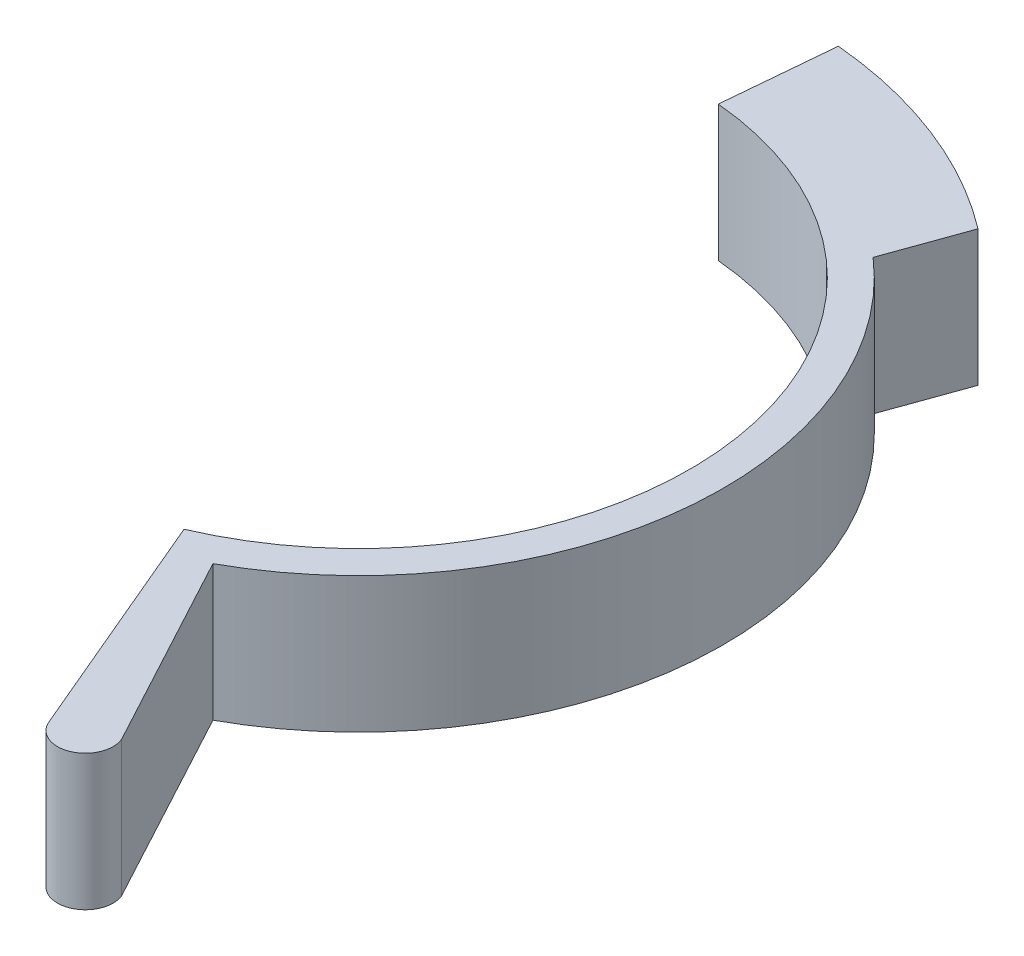
ISO-10303-21;
HEADER;
FILE_DESCRIPTION(('STEP AP214'),'2;1');
FILE_NAME('part.step','',(''),(''),'','','');
FILE_SCHEMA(('AUTOMOTIVE_DESIGN { 1 0 10303 214 1 1 1 1 }'));
ENDSEC;
DATA;
#1=APPLICATION_CONTEXT('core data for automotive mechanical design processes');
#2=APPLICATION_PROTOCOL_DEFINITION('international standard','automotive_design',2000,#1);
#3=PRODUCT_CONTEXT('',#1,'mechanical');
#4=PRODUCT('Part','Part','',(#3));
#5=PRODUCT_RELATED_PRODUCT_CATEGORY('part','',(#4));
#6=PRODUCT_DEFINITION_FORMATION('','',#4);
#7=PRODUCT_DEFINITION_CONTEXT('part definition',#1,'design');
#8=PRODUCT_DEFINITION('design','',#6,#7);
#9=PRODUCT_DEFINITION_SHAPE('','',#8);
#10=(LENGTH_UNIT() NAMED_UNIT(*) SI_UNIT(.MILLI.,.METRE.));
#11=(NAMED_UNIT(*) PLANE_ANGLE_UNIT() SI_UNIT($,.RADIAN.));
#12=(NAMED_UNIT(*) SI_UNIT($,.STERADIAN.) SOLID_ANGLE_UNIT());
#13=UNCERTAINTY_MEASURE_WITH_UNIT(LENGTH_MEASURE(1.E-05),#10,'distance_accuracy_value','');
#14=(GEOMETRIC_REPRESENTATION_CONTEXT(3) GLOBAL_UNCERTAINTY_ASSIGNED_CONTEXT((#13)) GLOBAL_UNIT_ASSIGNED_CONTEXT((#10,
#11,#12)) REPRESENTATION_CONTEXT('',''));
#15=CARTESIAN_POINT('',(0.,0.,0.));
#16=DIRECTION('',(0.,0.,1.));
#17=DIRECTION('',(1.,0.,0.));
#18=AXIS2_PLACEMENT_3D('',#15,#16,#17);
#19=CARTESIAN_POINT('',(0.,12.26,0.));
#20=DIRECTION('',(0.,-1.,0.));
#21=DIRECTION('',(0.,0.,-1.));
#22=AXIS2_PLACEMENT_3D('',#19,#20,#21);
#23=CYLINDRICAL_SURFACE('',#22,33.);
#24=CARTESIAN_POINT('',(0.,0.,0.));
#25=DIRECTION('',(0.,1.,0.));
#26=DIRECTION('',(0.,0.,1.));
#27=AXIS2_PLACEMENT_3D('',#24,#25,#26);
#28=CIRCLE('',#27,33.);
#29=CARTESIAN_POINT('',(15.8232931656359,0.,28.9589950342608));
#30=VERTEX_POINT('',#29);
#31=CARTESIAN_POINT('',(21.6864186998569,0.,-24.8736656722426));
#32=VERTEX_POINT('',#31);
#33=EDGE_CURVE('E130',#30,#32,#28,.T.);
#34=ORIENTED_EDGE('',*,*,#33,.T.);
#35=DIRECTION('',(0.,-1.,0.));
#36=VECTOR('',#35,1.);
#37=CARTESIAN_POINT('',(21.6864186998569,12.26,-24.8736656722426));
#38=LINE('',#37,#36);
#39=CARTESIAN_POINT('',(21.6864186998569,12.26,-24.8736656722426));
#40=VERTEX_POINT('',#39);
#41=EDGE_CURVE('E11',#40,#32,#38,.T.);
#42=ORIENTED_EDGE('',*,*,#41,.F.);
#43=CARTESIAN_POINT('',(0.,12.26,0.));
#44=DIRECTION('',(0.,1.,0.));
#45=DIRECTION('',(0.,0.,1.));
#46=AXIS2_PLACEMENT_3D('',#43,#44,#45);
#47=CIRCLE('',#46,33.);
#48=CARTESIAN_POINT('',(15.8232931656359,12.26,28.9589950342608));
#49=VERTEX_POINT('',#48);
#50=EDGE_CURVE('E146',#49,#40,#47,.T.);
#51=ORIENTED_EDGE('',*,*,#50,.F.);
#52=DIRECTION('',(0.,-1.,0.));
#53=VECTOR('',#52,1.);
#54=CARTESIAN_POINT('',(15.8232931656359,12.26,28.9589950342608));
#55=LINE('',#54,#53);
#56=EDGE_CURVE('E126',#49,#30,#55,.T.);
#57=ORIENTED_EDGE('',*,*,#56,.T.);
#58=EDGE_LOOP('',(#34,#42,#51,#57));
#59=FACE_BOUND('',#58,.T.);
#60=ADVANCED_FACE('F35',(#59),#23,.T.);
#61=CARTESIAN_POINT('',(11.2933852003912,12.26,4.05702486011401));
#62=DIRECTION('',(-0.94111543336594,0.,-0.338085405009502));
#63=DIRECTION('',(-0.338085405009502,0.,0.94111543336594));
#64=AXIS2_PLACEMENT_3D('',#61,#62,#63);
#65=PLANE('',#64);
#66=DIRECTION('',(0.338085405009502,0.,-0.94111543336594));
#67=VECTOR('',#66,1.);
#68=CARTESIAN_POINT('',(11.2933852003912,0.,4.05702486011401));
#69=LINE('',#68,#67);
#70=CARTESIAN_POINT('',(24.1939050154192,0.,-31.8536595896471));
#71=VERTEX_POINT('',#70);
#72=EDGE_CURVE('E133',#32,#71,#69,.T.);
#73=ORIENTED_EDGE('',*,*,#72,.T.);
#74=DIRECTION('',(0.,-1.,0.));
#75=VECTOR('',#74,1.);
#76=CARTESIAN_POINT('',(24.1939050154192,12.26,-31.8536595896471));
#77=LINE('',#76,#75);
#78=CARTESIAN_POINT('',(24.1939050154192,12.26,-31.8536595896471));
#79=VERTEX_POINT('',#78);
#80=EDGE_CURVE('E43',#79,#71,#77,.T.);
#81=ORIENTED_EDGE('',*,*,#80,.F.);
#82=DIRECTION('',(0.338085405009502,0.,-0.94111543336594));
#83=VECTOR('',#82,1.);
#84=CARTESIAN_POINT('',(11.2933852003912,12.26,4.05702486011401));
#85=LINE('',#84,#83);
#86=EDGE_CURVE('E94',#40,#79,#85,.T.);
#87=ORIENTED_EDGE('',*,*,#86,.F.);
#88=ORIENTED_EDGE('',*,*,#41,.T.);
#89=EDGE_LOOP('',(#73,#81,#87,#88));
#90=FACE_BOUND('',#89,.T.);
#91=ADVANCED_FACE('F178',(#90),#65,.F.);
#92=CARTESIAN_POINT('',(0.,12.26,0.));
#93=DIRECTION('',(0.,-1.,0.));
#94=DIRECTION('',(0.,0.,-1.));
#95=AXIS2_PLACEMENT_3D('',#92,#93,#94);
#96=CYLINDRICAL_SURFACE('',#95,40.0000083643522);
#97=CARTESIAN_POINT('',(0.,0.,0.));
#98=DIRECTION('',(0.,1.,0.));
#99=DIRECTION('',(0.,0.,1.));
#100=AXIS2_PLACEMENT_3D('',#97,#98,#99);
#101=CIRCLE('',#100,40.0000083643522);
#102=CARTESIAN_POINT('',(3.57874002113599,0.,-39.8395944885156));
#103=VERTEX_POINT('',#102);
#104=EDGE_CURVE('E135',#71,#103,#101,.T.);
#105=ORIENTED_EDGE('',*,*,#104,.T.);
#106=DIRECTION('',(0.,-1.,0.));
#107=VECTOR('',#106,1.);
#108=CARTESIAN_POINT('',(3.57874002113599,12.26,-39.8395944885156));
#109=LINE('',#108,#107);
#110=CARTESIAN_POINT('',(3.57874002113599,12.26,-39.8395944885156));
#111=VERTEX_POINT('',#110);
#112=EDGE_CURVE('E152',#111,#103,#109,.T.);
#113=ORIENTED_EDGE('',*,*,#112,.F.);
#114=CARTESIAN_POINT('',(0.,12.26,0.));
#115=DIRECTION('',(0.,1.,0.));
#116=DIRECTION('',(0.,0.,1.));
#117=AXIS2_PLACEMENT_3D('',#114,#115,#116);
#118=CIRCLE('',#117,40.0000083643522);
#119=EDGE_CURVE('E160',#79,#111,#118,.T.);
#120=ORIENTED_EDGE('',*,*,#119,.F.);
#121=ORIENTED_EDGE('',*,*,#80,.T.);
#122=EDGE_LOOP('',(#105,#113,#120,#121));
#123=FACE_BOUND('',#122,.T.);
#124=ADVANCED_FACE('F158',(#123),#96,.T.);
#125=CARTESIAN_POINT('',(0.,12.26,0.));
#126=DIRECTION('',(0.995989653942684,0.,0.0894684818197524));
#127=DIRECTION('',(0.0894684818197524,0.,-0.995989653942685));
#128=AXIS2_PLACEMENT_3D('',#125,#126,#127);
#129=PLANE('',#128);
#130=DIRECTION('',(-0.0894684818197524,0.,0.995989653942685));
#131=VECTOR('',#130,1.);
#132=CARTESIAN_POINT('',(0.,0.,0.));
#133=LINE('',#132,#131);
#134=CARTESIAN_POINT('',(2.68405445459257,0.,-29.8796896182805));
#135=VERTEX_POINT('',#134);
#136=EDGE_CURVE('E137',#103,#135,#133,.T.);
#137=ORIENTED_EDGE('',*,*,#136,.T.);
#138=DIRECTION('',(0.,-1.,0.));
#139=VECTOR('',#138,1.);
#140=CARTESIAN_POINT('',(2.68405445459257,12.26,-29.8796896182805));
#141=LINE('',#140,#139);
#142=CARTESIAN_POINT('',(2.68405445459257,12.26,-29.8796896182805));
#143=VERTEX_POINT('',#142);
#144=EDGE_CURVE('E150',#143,#135,#141,.T.);
#145=ORIENTED_EDGE('',*,*,#144,.F.);
#146=DIRECTION('',(-0.0894684818197524,0.,0.995989653942685));
#147=VECTOR('',#146,1.);
#148=CARTESIAN_POINT('',(0.,12.26,0.));
#149=LINE('',#148,#147);
#150=EDGE_CURVE('E170',#111,#143,#149,.T.);
#151=ORIENTED_EDGE('',*,*,#150,.F.);
#152=ORIENTED_EDGE('',*,*,#112,.T.);
#153=EDGE_LOOP('',(#137,#145,#151,#152));
#154=FACE_BOUND('',#153,.T.);
#155=ADVANCED_FACE('F168',(#154),#129,.F.);
#156=CARTESIAN_POINT('',(0.,12.26,0.));
#157=DIRECTION('',(0.,-1.,0.));
#158=DIRECTION('',(0.,0.,-1.));
#159=AXIS2_PLACEMENT_3D('',#156,#157,#158);
#160=CYLINDRICAL_SURFACE('',#159,30.);
#161=CARTESIAN_POINT('',(0.,0.,0.));
#162=DIRECTION('',(0.,1.,0.));
#163=DIRECTION('',(0.,0.,1.));
#164=AXIS2_PLACEMENT_3D('',#161,#162,#163);
#165=CIRCLE('',#164,30.);
#166=CARTESIAN_POINT('',(11.8236451733782,0.,27.5717503037811));
#167=VERTEX_POINT('',#166);
#168=EDGE_CURVE('E140',#167,#135,#165,.T.);
#169=ORIENTED_EDGE('',*,*,#168,.F.);
#170=DIRECTION('',(0.,-1.,0.));
#171=VECTOR('',#170,1.);
#172=CARTESIAN_POINT('',(11.8236451733782,12.26,27.5717503037811));
#173=LINE('',#172,#171);
#174=CARTESIAN_POINT('',(11.8236451733782,12.26,27.5717503037811));
#175=VERTEX_POINT('',#174);
#176=EDGE_CURVE('E121',#175,#167,#173,.T.);
#177=ORIENTED_EDGE('',*,*,#176,.F.);
#178=CARTESIAN_POINT('',(0.,12.26,0.));
#179=DIRECTION('',(0.,1.,0.));
#180=DIRECTION('',(0.,0.,1.));
#181=AXIS2_PLACEMENT_3D('',#178,#179,#180);
#182=CIRCLE('',#181,30.);
#183=EDGE_CURVE('E114',#175,#143,#182,.T.);
#184=ORIENTED_EDGE('',*,*,#183,.T.);
#185=ORIENTED_EDGE('',*,*,#144,.T.);
#186=EDGE_LOOP('',(#169,#177,#184,#185));
#187=FACE_BOUND('',#186,.T.);
#188=ADVANCED_FACE('F188',(#187),#160,.F.);
#189=CARTESIAN_POINT('',(0.121103357338385,12.26,-0.0513055872205986));
#190=DIRECTION('',(0.920777378559709,0.,-0.39008847603167));
#191=DIRECTION('',(-0.39008847603167,0.,-0.920777378559709));
#192=AXIS2_PLACEMENT_3D('',#189,#190,#191);
#193=PLANE('',#192);
#194=DIRECTION('',(0.39008847603167,0.,0.920777378559709));
#195=VECTOR('',#194,1.);
#196=CARTESIAN_POINT('',(0.121103357338385,0.,-0.0513055872205986));
#197=LINE('',#196,#195);
#198=CARTESIAN_POINT('',(20.7956903462746,0.,48.7496541441093));
#199=VERTEX_POINT('',#198);
#200=EDGE_CURVE('E120',#167,#199,#197,.T.);
#201=ORIENTED_EDGE('',*,*,#200,.T.);
#202=DIRECTION('',(0.,-1.,0.));
#203=VECTOR('',#202,1.);
#204=CARTESIAN_POINT('',(20.7956903462746,12.26,48.7496541441093));
#205=LINE('',#204,#203);
#206=CARTESIAN_POINT('',(20.7956903462746,12.26,48.7496541441093));
#207=VERTEX_POINT('',#206);
#208=EDGE_CURVE('E117',#207,#199,#205,.T.);
#209=ORIENTED_EDGE('',*,*,#208,.F.);
#210=DIRECTION('',(0.39008847603167,0.,0.920777378559709));
#211=VECTOR('',#210,1.);
#212=CARTESIAN_POINT('',(0.121103357338385,12.26,-0.0513055872205986));
#213=LINE('',#212,#211);
#214=EDGE_CURVE('E108',#175,#207,#213,.T.);
#215=ORIENTED_EDGE('',*,*,#214,.F.);
#216=ORIENTED_EDGE('',*,*,#176,.T.);
#217=EDGE_LOOP('',(#201,#209,#215,#216));
#218=FACE_BOUND('',#217,.T.);
#219=ADVANCED_FACE('F118',(#218),#193,.F.);
#220=CARTESIAN_POINT('',(23.1246397537649,12.26,47.8018296540694));
#221=DIRECTION('',(0.,-1.,0.));
#222=DIRECTION('',(0.,0.,-1.));
#223=AXIS2_PLACEMENT_3D('',#220,#221,#222);
#224=CYLINDRICAL_SURFACE('',#223,2.51443365523314);
#225=CARTESIAN_POINT('',(23.1246397537649,0.,47.8018296540694));
#226=DIRECTION('',(0.,1.,0.));
#227=DIRECTION('',(0.,0.,1.));
#228=AXIS2_PLACEMENT_3D('',#225,#226,#227);
#229=CIRCLE('',#228,2.51443365523314);
#230=CARTESIAN_POINT('',(25.4535891612553,0.,46.8540051640295));
#231=VERTEX_POINT('',#230);
#232=EDGE_CURVE('E80',#199,#231,#229,.T.);
#233=ORIENTED_EDGE('',*,*,#232,.T.);
#234=DIRECTION('',(0.,-1.,0.));
#235=VECTOR('',#234,1.);
#236=CARTESIAN_POINT('',(25.4535891612553,12.26,46.8540051640295));
#237=LINE('',#236,#235);
#238=CARTESIAN_POINT('',(25.4535891612553,12.26,46.8540051640295));
#239=VERTEX_POINT('',#238);
#240=EDGE_CURVE('E122',#239,#231,#237,.T.);
#241=ORIENTED_EDGE('',*,*,#240,.F.);
#242=CARTESIAN_POINT('',(23.1246397537649,12.26,47.8018296540694));
#243=DIRECTION('',(0.,1.,0.));
#244=DIRECTION('',(0.,0.,1.));
#245=AXIS2_PLACEMENT_3D('',#242,#243,#244);
#246=CIRCLE('',#245,2.51443365523314);
#247=EDGE_CURVE('E112',#207,#239,#246,.T.);
#248=ORIENTED_EDGE('',*,*,#247,.F.);
#249=ORIENTED_EDGE('',*,*,#208,.T.);
#250=EDGE_LOOP('',(#233,#241,#248,#249));
#251=FACE_BOUND('',#250,.T.);
#252=ADVANCED_FACE('F124',(#251),#224,.T.);
#253=CARTESIAN_POINT('',(0.185214082331555,12.26,-0.0996739550564852));
#254=DIRECTION('',(-0.880583613390415,0.,0.473890810027246));
#255=DIRECTION('',(0.473890810027246,0.,0.880583613390416));
#256=AXIS2_PLACEMENT_3D('',#253,#254,#255);
#257=PLANE('',#256);
#258=DIRECTION('',(-0.473890810027246,0.,-0.880583613390416));
#259=VECTOR('',#258,1.);
#260=CARTESIAN_POINT('',(0.185214082331555,0.,-0.0996739550564852));
#261=LINE('',#260,#259);
#262=EDGE_CURVE('E86',#231,#30,#261,.T.);
#263=ORIENTED_EDGE('',*,*,#262,.T.);
#264=ORIENTED_EDGE('',*,*,#56,.F.);
#265=DIRECTION('',(-0.473890810027246,0.,-0.880583613390416));
#266=VECTOR('',#265,1.);
#267=CARTESIAN_POINT('',(0.185214082331555,12.26,-0.0996739550564852));
#268=LINE('',#267,#266);
#269=EDGE_CURVE('E51',#239,#49,#268,.T.);
#270=ORIENTED_EDGE('',*,*,#269,.F.);
#271=ORIENTED_EDGE('',*,*,#240,.T.);
#272=EDGE_LOOP('',(#263,#264,#270,#271));
#273=FACE_BOUND('',#272,.T.);
#274=ADVANCED_FACE('F196',(#273),#257,.F.);
#275=CARTESIAN_POINT('',(0.,12.26,0.));
#276=DIRECTION('',(0.,1.,0.));
#277=DIRECTION('',(0.,0.,1.));
#278=AXIS2_PLACEMENT_3D('',#275,#276,#277);
#279=PLANE('',#278);
#280=ORIENTED_EDGE('',*,*,#50,.T.);
#281=ORIENTED_EDGE('',*,*,#86,.T.);
#282=ORIENTED_EDGE('',*,*,#119,.T.);
#283=ORIENTED_EDGE('',*,*,#150,.T.);
#284=ORIENTED_EDGE('',*,*,#183,.F.);
#285=ORIENTED_EDGE('',*,*,#214,.T.);
#286=ORIENTED_EDGE('',*,*,#247,.T.);
#287=ORIENTED_EDGE('',*,*,#269,.T.);
#288=EDGE_LOOP('',(#280,#281,#282,#283,#284,#285,#286,#287));
#289=FACE_BOUND('',#288,.T.);
#290=ADVANCED_FACE('F110',(#289),#279,.T.);
#291=CARTESIAN_POINT('',(0.,0.,0.));
#292=DIRECTION('',(0.,1.,0.));
#293=DIRECTION('',(0.,0.,1.));
#294=AXIS2_PLACEMENT_3D('',#291,#292,#293);
#295=PLANE('',#294);
#296=ORIENTED_EDGE('',*,*,#33,.F.);
#297=ORIENTED_EDGE('',*,*,#262,.F.);
#298=ORIENTED_EDGE('',*,*,#232,.F.);
#299=ORIENTED_EDGE('',*,*,#200,.F.);
#300=ORIENTED_EDGE('',*,*,#168,.T.);
#301=ORIENTED_EDGE('',*,*,#136,.F.);
#302=ORIENTED_EDGE('',*,*,#104,.F.);
#303=ORIENTED_EDGE('',*,*,#72,.F.);
#304=EDGE_LOOP('',(#296,#297,#298,#299,#300,#301,#302,#303));
#305=FACE_BOUND('',#304,.T.);
#306=ADVANCED_FACE('F164',(#305),#295,.F.);
#307=CLOSED_SHELL('',(#60,#91,#124,#155,#188,#219,#252,#274,#290,#306));
#308=MANIFOLD_SOLID_BREP('B2',#307);
#309=ADVANCED_BREP_SHAPE_REPRESENTATION('',(#18,#308),#14);
#310=SHAPE_DEFINITION_REPRESENTATION(#9,#309);
ENDSEC;
END-ISO-10303-21;
